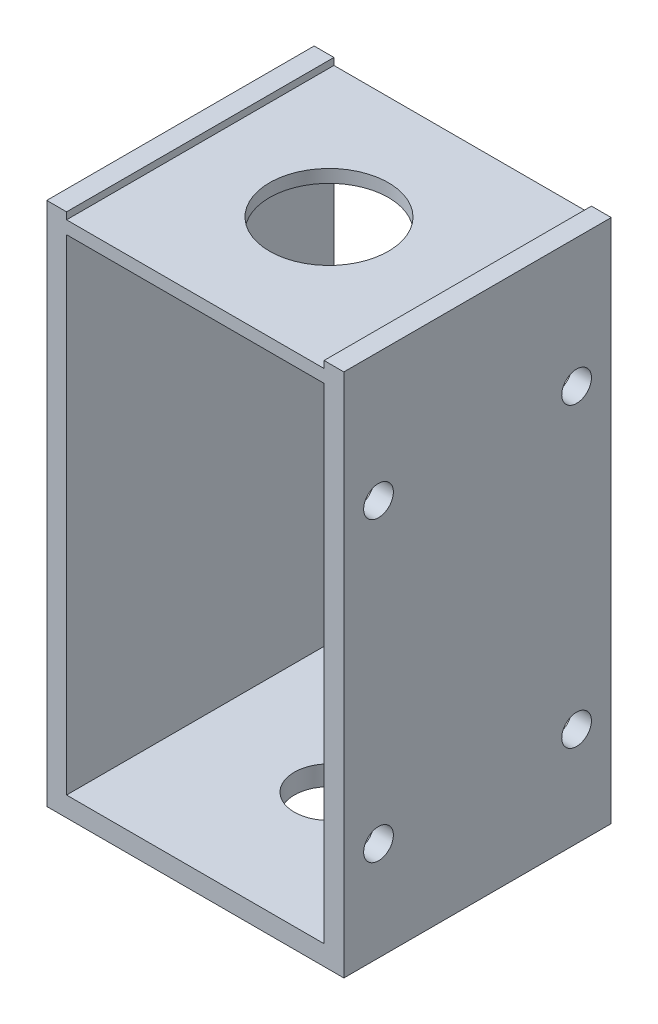
ISO-10303-21;
HEADER;
FILE_DESCRIPTION(('STEP AP214'),'2;1');
FILE_NAME('part.step','',(''),(''),'','','');
FILE_SCHEMA(('AUTOMOTIVE_DESIGN { 1 0 10303 214 1 1 1 1 }'));
ENDSEC;
DATA;
#1=APPLICATION_CONTEXT('core data for automotive mechanical design processes');
#2=APPLICATION_PROTOCOL_DEFINITION('international standard','automotive_design',2000,#1);
#3=PRODUCT_CONTEXT('',#1,'mechanical');
#4=PRODUCT('Part','Part','',(#3));
#5=PRODUCT_RELATED_PRODUCT_CATEGORY('part','',(#4));
#6=PRODUCT_DEFINITION_FORMATION('','',#4);
#7=PRODUCT_DEFINITION_CONTEXT('part definition',#1,'design');
#8=PRODUCT_DEFINITION('design','',#6,#7);
#9=PRODUCT_DEFINITION_SHAPE('','',#8);
#10=(LENGTH_UNIT() NAMED_UNIT(*) SI_UNIT(.MILLI.,.METRE.));
#11=(NAMED_UNIT(*) PLANE_ANGLE_UNIT() SI_UNIT($,.RADIAN.));
#12=(NAMED_UNIT(*) SI_UNIT($,.STERADIAN.) SOLID_ANGLE_UNIT());
#13=UNCERTAINTY_MEASURE_WITH_UNIT(LENGTH_MEASURE(1.E-05),#10,'distance_accuracy_value','');
#14=(GEOMETRIC_REPRESENTATION_CONTEXT(3) GLOBAL_UNCERTAINTY_ASSIGNED_CONTEXT((#13)) GLOBAL_UNIT_ASSIGNED_CONTEXT((#10,
#11,#12)) REPRESENTATION_CONTEXT('',''));
#15=CARTESIAN_POINT('',(0.,0.,0.));
#16=DIRECTION('',(0.,0.,1.));
#17=DIRECTION('',(1.,0.,0.));
#18=AXIS2_PLACEMENT_3D('',#15,#16,#17);
#19=CARTESIAN_POINT('',(-15.,26.5,27.));
#20=DIRECTION('',(0.,-1.,0.));
#21=DIRECTION('',(0.,0.,-1.));
#22=AXIS2_PLACEMENT_3D('',#19,#20,#21);
#23=PLANE('',#22);
#24=DIRECTION('',(-1.,0.,0.));
#25=VECTOR('',#24,1.);
#26=CARTESIAN_POINT('',(-15.,26.5,27.));
#27=LINE('',#26,#25);
#28=CARTESIAN_POINT('',(-13.,26.5,27.));
#29=VERTEX_POINT('',#28);
#30=CARTESIAN_POINT('',(-15.,26.5,27.));
#31=VERTEX_POINT('',#30);
#32=EDGE_CURVE('E222',#29,#31,#27,.T.);
#33=ORIENTED_EDGE('',*,*,#32,.F.);
#34=DIRECTION('',(0.,0.,1.));
#35=VECTOR('',#34,1.);
#36=CARTESIAN_POINT('',(-13.,26.5,0.));
#37=LINE('',#36,#35);
#38=CARTESIAN_POINT('',(-13.,26.5,0.));
#39=VERTEX_POINT('',#38);
#40=EDGE_CURVE('E156',#39,#29,#37,.T.);
#41=ORIENTED_EDGE('',*,*,#40,.F.);
#42=DIRECTION('',(-1.,0.,0.));
#43=VECTOR('',#42,1.);
#44=CARTESIAN_POINT('',(-15.,26.5,0.));
#45=LINE('',#44,#43);
#46=CARTESIAN_POINT('',(-15.,26.5,0.));
#47=VERTEX_POINT('',#46);
#48=EDGE_CURVE('E233',#39,#47,#45,.T.);
#49=ORIENTED_EDGE('',*,*,#48,.T.);
#50=DIRECTION('',(0.,0.,-1.));
#51=VECTOR('',#50,1.);
#52=CARTESIAN_POINT('',(-15.,26.5,27.));
#53=LINE('',#52,#51);
#54=EDGE_CURVE('E69',#31,#47,#53,.T.);
#55=ORIENTED_EDGE('',*,*,#54,.F.);
#56=EDGE_LOOP('',(#33,#41,#49,#55));
#57=FACE_BOUND('',#56,.T.);
#58=ADVANCED_FACE('F60',(#57),#23,.F.);
#59=CARTESIAN_POINT('',(0.,0.,27.));
#60=DIRECTION('',(0.,0.,1.));
#61=DIRECTION('',(1.,0.,0.));
#62=AXIS2_PLACEMENT_3D('',#59,#60,#61);
#63=PLANE('',#62);
#64=DIRECTION('',(0.,1.,0.));
#65=VECTOR('',#64,1.);
#66=CARTESIAN_POINT('',(-13.,25.8,27.));
#67=LINE('',#66,#65);
#68=CARTESIAN_POINT('',(-13.,25.8,27.));
#69=VERTEX_POINT('',#68);
#70=EDGE_CURVE('E150',#69,#29,#67,.T.);
#71=ORIENTED_EDGE('',*,*,#70,.T.);
#72=ORIENTED_EDGE('',*,*,#32,.T.);
#73=DIRECTION('',(0.,-1.,0.));
#74=VECTOR('',#73,1.);
#75=CARTESIAN_POINT('',(-15.,26.5,27.));
#76=LINE('',#75,#74);
#77=CARTESIAN_POINT('',(-15.,-26.5,27.));
#78=VERTEX_POINT('',#77);
#79=EDGE_CURVE('E226',#31,#78,#76,.T.);
#80=ORIENTED_EDGE('',*,*,#79,.T.);
#81=DIRECTION('',(1.,0.,0.));
#82=VECTOR('',#81,1.);
#83=CARTESIAN_POINT('',(-15.,-26.5,27.));
#84=LINE('',#83,#82);
#85=CARTESIAN_POINT('',(15.,-26.5,27.));
#86=VERTEX_POINT('',#85);
#87=EDGE_CURVE('E228',#78,#86,#84,.T.);
#88=ORIENTED_EDGE('',*,*,#87,.T.);
#89=DIRECTION('',(0.,1.,0.));
#90=VECTOR('',#89,1.);
#91=CARTESIAN_POINT('',(15.,26.5,27.));
#92=LINE('',#91,#90);
#93=CARTESIAN_POINT('',(15.,26.5,27.));
#94=VERTEX_POINT('',#93);
#95=EDGE_CURVE('E219',#86,#94,#92,.T.);
#96=ORIENTED_EDGE('',*,*,#95,.T.);
#97=CARTESIAN_POINT('',(13.,26.5,27.));
#98=VERTEX_POINT('',#97);
#99=EDGE_CURVE('E224',#94,#98,#27,.T.);
#100=ORIENTED_EDGE('',*,*,#99,.T.);
#101=DIRECTION('',(0.,1.,0.));
#102=VECTOR('',#101,1.);
#103=CARTESIAN_POINT('',(13.,25.8,27.));
#104=LINE('',#103,#102);
#105=CARTESIAN_POINT('',(13.,25.8,27.));
#106=VERTEX_POINT('',#105);
#107=EDGE_CURVE('E77',#106,#98,#104,.T.);
#108=ORIENTED_EDGE('',*,*,#107,.F.);
#109=DIRECTION('',(1.,0.,0.));
#110=VECTOR('',#109,1.);
#111=CARTESIAN_POINT('',(-13.,25.8,27.));
#112=LINE('',#111,#110);
#113=EDGE_CURVE('E166',#69,#106,#112,.T.);
#114=ORIENTED_EDGE('',*,*,#113,.F.);
#115=EDGE_LOOP('',(#71,#72,#80,#88,#96,#100,#108,#114));
#116=FACE_BOUND('',#115,.T.);
#117=DIRECTION('',(-1.,0.,0.));
#118=VECTOR('',#117,1.);
#119=CARTESIAN_POINT('',(-15.,24.5,27.));
#120=LINE('',#119,#118);
#121=CARTESIAN_POINT('',(13.,24.5,27.));
#122=VERTEX_POINT('',#121);
#123=CARTESIAN_POINT('',(-13.,24.5,27.));
#124=VERTEX_POINT('',#123);
#125=EDGE_CURVE('E192',#122,#124,#120,.T.);
#126=ORIENTED_EDGE('',*,*,#125,.F.);
#127=DIRECTION('',(0.,1.,0.));
#128=VECTOR('',#127,1.);
#129=CARTESIAN_POINT('',(13.,26.5,27.));
#130=LINE('',#129,#128);
#131=CARTESIAN_POINT('',(13.,-24.5,27.));
#132=VERTEX_POINT('',#131);
#133=EDGE_CURVE('E190',#132,#122,#130,.T.);
#134=ORIENTED_EDGE('',*,*,#133,.F.);
#135=DIRECTION('',(1.,0.,0.));
#136=VECTOR('',#135,1.);
#137=CARTESIAN_POINT('',(-15.,-24.5,27.));
#138=LINE('',#137,#136);
#139=CARTESIAN_POINT('',(-13.,-24.5,27.));
#140=VERTEX_POINT('',#139);
#141=EDGE_CURVE('E197',#140,#132,#138,.T.);
#142=ORIENTED_EDGE('',*,*,#141,.F.);
#143=DIRECTION('',(0.,-1.,0.));
#144=VECTOR('',#143,1.);
#145=CARTESIAN_POINT('',(-13.,26.5,27.));
#146=LINE('',#145,#144);
#147=EDGE_CURVE('E195',#124,#140,#146,.T.);
#148=ORIENTED_EDGE('',*,*,#147,.F.);
#149=EDGE_LOOP('',(#126,#134,#142,#148));
#150=FACE_BOUND('',#149,.T.);
#151=ADVANCED_FACE('F171',(#116,#150),#63,.T.);
#152=CARTESIAN_POINT('',(0.,0.,0.));
#153=DIRECTION('',(0.,0.,1.));
#154=DIRECTION('',(1.,0.,0.));
#155=AXIS2_PLACEMENT_3D('',#152,#153,#154);
#156=PLANE('',#155);
#157=ORIENTED_EDGE('',*,*,#48,.F.);
#158=DIRECTION('',(0.,1.,0.));
#159=VECTOR('',#158,1.);
#160=CARTESIAN_POINT('',(-13.,25.8,0.));
#161=LINE('',#160,#159);
#162=CARTESIAN_POINT('',(-13.,25.8,0.));
#163=VERTEX_POINT('',#162);
#164=EDGE_CURVE('E183',#163,#39,#161,.T.);
#165=ORIENTED_EDGE('',*,*,#164,.F.);
#166=DIRECTION('',(-1.,0.,0.));
#167=VECTOR('',#166,1.);
#168=CARTESIAN_POINT('',(-13.,25.8,0.));
#169=LINE('',#168,#167);
#170=CARTESIAN_POINT('',(13.,25.8,0.));
#171=VERTEX_POINT('',#170);
#172=EDGE_CURVE('E160',#171,#163,#169,.T.);
#173=ORIENTED_EDGE('',*,*,#172,.F.);
#174=DIRECTION('',(0.,1.,0.));
#175=VECTOR('',#174,1.);
#176=CARTESIAN_POINT('',(13.,25.8,0.));
#177=LINE('',#176,#175);
#178=CARTESIAN_POINT('',(13.,26.5,0.));
#179=VERTEX_POINT('',#178);
#180=EDGE_CURVE('E186',#171,#179,#177,.T.);
#181=ORIENTED_EDGE('',*,*,#180,.T.);
#182=CARTESIAN_POINT('',(15.,26.5,0.));
#183=VERTEX_POINT('',#182);
#184=EDGE_CURVE('E234',#183,#179,#45,.T.);
#185=ORIENTED_EDGE('',*,*,#184,.F.);
#186=DIRECTION('',(0.,1.,0.));
#187=VECTOR('',#186,1.);
#188=CARTESIAN_POINT('',(15.,26.5,0.));
#189=LINE('',#188,#187);
#190=CARTESIAN_POINT('',(15.,-26.5,0.));
#191=VERTEX_POINT('',#190);
#192=EDGE_CURVE('E218',#191,#183,#189,.T.);
#193=ORIENTED_EDGE('',*,*,#192,.F.);
#194=DIRECTION('',(1.,0.,0.));
#195=VECTOR('',#194,1.);
#196=CARTESIAN_POINT('',(-15.,-26.5,0.));
#197=LINE('',#196,#195);
#198=CARTESIAN_POINT('',(-15.,-26.5,0.));
#199=VERTEX_POINT('',#198);
#200=EDGE_CURVE('E223',#199,#191,#197,.T.);
#201=ORIENTED_EDGE('',*,*,#200,.F.);
#202=DIRECTION('',(0.,-1.,0.));
#203=VECTOR('',#202,1.);
#204=CARTESIAN_POINT('',(-15.,26.5,0.));
#205=LINE('',#204,#203);
#206=EDGE_CURVE('E237',#47,#199,#205,.T.);
#207=ORIENTED_EDGE('',*,*,#206,.F.);
#208=EDGE_LOOP('',(#157,#165,#173,#181,#185,#193,#201,#207));
#209=FACE_BOUND('',#208,.T.);
#210=DIRECTION('',(0.,1.,0.));
#211=VECTOR('',#210,1.);
#212=CARTESIAN_POINT('',(13.,26.5,0.));
#213=LINE('',#212,#211);
#214=CARTESIAN_POINT('',(13.,-24.5,0.));
#215=VERTEX_POINT('',#214);
#216=CARTESIAN_POINT('',(13.,24.5,0.));
#217=VERTEX_POINT('',#216);
#218=EDGE_CURVE('E185',#215,#217,#213,.T.);
#219=ORIENTED_EDGE('',*,*,#218,.T.);
#220=DIRECTION('',(-1.,0.,0.));
#221=VECTOR('',#220,1.);
#222=CARTESIAN_POINT('',(-15.,24.5,0.));
#223=LINE('',#222,#221);
#224=CARTESIAN_POINT('',(-13.,24.5,0.));
#225=VERTEX_POINT('',#224);
#226=EDGE_CURVE('E202',#217,#225,#223,.T.);
#227=ORIENTED_EDGE('',*,*,#226,.T.);
#228=DIRECTION('',(0.,-1.,0.));
#229=VECTOR('',#228,1.);
#230=CARTESIAN_POINT('',(-13.,26.5,0.));
#231=LINE('',#230,#229);
#232=CARTESIAN_POINT('',(-13.,-24.5,0.));
#233=VERTEX_POINT('',#232);
#234=EDGE_CURVE('E205',#225,#233,#231,.T.);
#235=ORIENTED_EDGE('',*,*,#234,.T.);
#236=DIRECTION('',(1.,0.,0.));
#237=VECTOR('',#236,1.);
#238=CARTESIAN_POINT('',(-15.,-24.5,0.));
#239=LINE('',#238,#237);
#240=EDGE_CURVE('E193',#233,#215,#239,.T.);
#241=ORIENTED_EDGE('',*,*,#240,.T.);
#242=EDGE_LOOP('',(#219,#227,#235,#241));
#243=FACE_BOUND('',#242,.T.);
#244=ADVANCED_FACE('F305',(#209,#243),#156,.F.);
#245=CARTESIAN_POINT('',(15.,26.5,27.));
#246=DIRECTION('',(-1.,0.,0.));
#247=DIRECTION('',(0.,-1.,0.));
#248=AXIS2_PLACEMENT_3D('',#245,#246,#247);
#249=PLANE('',#248);
#250=CARTESIAN_POINT('',(15.,13.5,3.5));
#251=DIRECTION('',(1.,0.,0.));
#252=DIRECTION('',(0.,1.,0.));
#253=AXIS2_PLACEMENT_3D('',#250,#251,#252);
#254=CIRCLE('',#253,1.5);
#255=CARTESIAN_POINT('',(15.,15.,3.5));
#256=VERTEX_POINT('',#255);
#257=EDGE_CURVE('E269',#256,#256,#254,.T.);
#258=ORIENTED_EDGE('',*,*,#257,.F.);
#259=EDGE_LOOP('',(#258));
#260=FACE_BOUND('',#259,.T.);
#261=CARTESIAN_POINT('',(15.,-16.5,23.5));
#262=DIRECTION('',(1.,0.,0.));
#263=DIRECTION('',(0.,-1.,0.));
#264=AXIS2_PLACEMENT_3D('',#261,#262,#263);
#265=CIRCLE('',#264,1.5);
#266=CARTESIAN_POINT('',(15.,-18.,23.5));
#267=VERTEX_POINT('',#266);
#268=EDGE_CURVE('E270',#267,#267,#265,.T.);
#269=ORIENTED_EDGE('',*,*,#268,.F.);
#270=EDGE_LOOP('',(#269));
#271=FACE_BOUND('',#270,.T.);
#272=CARTESIAN_POINT('',(15.,13.5,23.5));
#273=DIRECTION('',(1.,0.,0.));
#274=DIRECTION('',(0.,-1.,0.));
#275=AXIS2_PLACEMENT_3D('',#272,#273,#274);
#276=CIRCLE('',#275,1.5);
#277=CARTESIAN_POINT('',(15.,12.,23.5));
#278=VERTEX_POINT('',#277);
#279=EDGE_CURVE('E273',#278,#278,#276,.T.);
#280=ORIENTED_EDGE('',*,*,#279,.F.);
#281=EDGE_LOOP('',(#280));
#282=FACE_BOUND('',#281,.T.);
#283=CARTESIAN_POINT('',(15.,-16.5,3.49999999999999));
#284=DIRECTION('',(1.,0.,0.));
#285=DIRECTION('',(0.,1.,0.));
#286=AXIS2_PLACEMENT_3D('',#283,#284,#285);
#287=CIRCLE('',#286,1.5);
#288=CARTESIAN_POINT('',(15.,-15.,3.49999999999999));
#289=VERTEX_POINT('',#288);
#290=EDGE_CURVE('E254',#289,#289,#287,.T.);
#291=ORIENTED_EDGE('',*,*,#290,.F.);
#292=EDGE_LOOP('',(#291));
#293=FACE_BOUND('',#292,.T.);
#294=ORIENTED_EDGE('',*,*,#192,.T.);
#295=DIRECTION('',(0.,0.,-1.));
#296=VECTOR('',#295,1.);
#297=CARTESIAN_POINT('',(15.,26.5,27.));
#298=LINE('',#297,#296);
#299=EDGE_CURVE('E12',#94,#183,#298,.T.);
#300=ORIENTED_EDGE('',*,*,#299,.F.);
#301=ORIENTED_EDGE('',*,*,#95,.F.);
#302=DIRECTION('',(0.,0.,-1.));
#303=VECTOR('',#302,1.);
#304=CARTESIAN_POINT('',(15.,-26.5,27.));
#305=LINE('',#304,#303);
#306=EDGE_CURVE('E230',#86,#191,#305,.T.);
#307=ORIENTED_EDGE('',*,*,#306,.T.);
#308=EDGE_LOOP('',(#294,#300,#301,#307));
#309=FACE_BOUND('',#308,.T.);
#310=ADVANCED_FACE('F62',(#260,#271,#282,#293,#309),#249,.F.);
#311=ORIENTED_EDGE('',*,*,#184,.T.);
#312=DIRECTION('',(0.,0.,-1.));
#313=VECTOR('',#312,1.);
#314=CARTESIAN_POINT('',(13.,26.5,0.));
#315=LINE('',#314,#313);
#316=EDGE_CURVE('E169',#98,#179,#315,.T.);
#317=ORIENTED_EDGE('',*,*,#316,.F.);
#318=ORIENTED_EDGE('',*,*,#99,.F.);
#319=ORIENTED_EDGE('',*,*,#299,.T.);
#320=EDGE_LOOP('',(#311,#317,#318,#319));
#321=FACE_BOUND('',#320,.T.);
#322=ADVANCED_FACE('F301',(#321),#23,.F.);
#323=CARTESIAN_POINT('',(-15.,26.5,27.));
#324=DIRECTION('',(1.,0.,0.));
#325=DIRECTION('',(0.,1.,0.));
#326=AXIS2_PLACEMENT_3D('',#323,#324,#325);
#327=PLANE('',#326);
#328=ORIENTED_EDGE('',*,*,#206,.T.);
#329=DIRECTION('',(0.,0.,-1.));
#330=VECTOR('',#329,1.);
#331=CARTESIAN_POINT('',(-15.,-26.5,27.));
#332=LINE('',#331,#330);
#333=EDGE_CURVE('E242',#78,#199,#332,.T.);
#334=ORIENTED_EDGE('',*,*,#333,.F.);
#335=ORIENTED_EDGE('',*,*,#79,.F.);
#336=ORIENTED_EDGE('',*,*,#54,.T.);
#337=EDGE_LOOP('',(#328,#334,#335,#336));
#338=FACE_BOUND('',#337,.T.);
#339=ADVANCED_FACE('F309',(#338),#327,.F.);
#340=CARTESIAN_POINT('',(-15.,-26.5,27.));
#341=DIRECTION('',(0.,1.,0.));
#342=DIRECTION('',(0.,0.,1.));
#343=AXIS2_PLACEMENT_3D('',#340,#341,#342);
#344=PLANE('',#343);
#345=CARTESIAN_POINT('',(0.,-26.5,13.5));
#346=DIRECTION('',(0.,-1.,0.));
#347=DIRECTION('',(0.,0.,-1.));
#348=AXIS2_PLACEMENT_3D('',#345,#346,#347);
#349=CIRCLE('',#348,3.5);
#350=CARTESIAN_POINT('',(0.,-26.5,10.));
#351=VERTEX_POINT('',#350);
#352=EDGE_CURVE('E249',#351,#351,#349,.T.);
#353=ORIENTED_EDGE('',*,*,#352,.F.);
#354=EDGE_LOOP('',(#353));
#355=FACE_BOUND('',#354,.T.);
#356=ORIENTED_EDGE('',*,*,#200,.T.);
#357=ORIENTED_EDGE('',*,*,#306,.F.);
#358=ORIENTED_EDGE('',*,*,#87,.F.);
#359=ORIENTED_EDGE('',*,*,#333,.T.);
#360=EDGE_LOOP('',(#356,#357,#358,#359));
#361=FACE_BOUND('',#360,.T.);
#362=ADVANCED_FACE('F315',(#355,#361),#344,.F.);
#363=CARTESIAN_POINT('',(13.,26.5,27.));
#364=DIRECTION('',(-1.,0.,0.));
#365=DIRECTION('',(0.,-1.,0.));
#366=AXIS2_PLACEMENT_3D('',#363,#364,#365);
#367=PLANE('',#366);
#368=CARTESIAN_POINT('',(13.,13.5,3.5));
#369=DIRECTION('',(-1.,0.,0.));
#370=DIRECTION('',(0.,-1.,0.));
#371=AXIS2_PLACEMENT_3D('',#368,#369,#370);
#372=CIRCLE('',#371,1.5);
#373=CARTESIAN_POINT('',(13.,12.,3.5));
#374=VERTEX_POINT('',#373);
#375=EDGE_CURVE('E64',#374,#374,#372,.T.);
#376=ORIENTED_EDGE('',*,*,#375,.F.);
#377=EDGE_LOOP('',(#376));
#378=FACE_BOUND('',#377,.T.);
#379=CARTESIAN_POINT('',(13.,-16.5,23.5));
#380=DIRECTION('',(-1.,0.,0.));
#381=DIRECTION('',(0.,-1.,0.));
#382=AXIS2_PLACEMENT_3D('',#379,#380,#381);
#383=CIRCLE('',#382,1.5);
#384=CARTESIAN_POINT('',(13.,-18.,23.5));
#385=VERTEX_POINT('',#384);
#386=EDGE_CURVE('E256',#385,#385,#383,.T.);
#387=ORIENTED_EDGE('',*,*,#386,.F.);
#388=EDGE_LOOP('',(#387));
#389=FACE_BOUND('',#388,.T.);
#390=CARTESIAN_POINT('',(13.,13.5,23.5));
#391=DIRECTION('',(-1.,0.,0.));
#392=DIRECTION('',(0.,-1.,0.));
#393=AXIS2_PLACEMENT_3D('',#390,#391,#392);
#394=CIRCLE('',#393,1.5);
#395=CARTESIAN_POINT('',(13.,12.,23.5));
#396=VERTEX_POINT('',#395);
#397=EDGE_CURVE('E253',#396,#396,#394,.T.);
#398=ORIENTED_EDGE('',*,*,#397,.F.);
#399=EDGE_LOOP('',(#398));
#400=FACE_BOUND('',#399,.T.);
#401=CARTESIAN_POINT('',(13.,-16.5,3.49999999999999));
#402=DIRECTION('',(-1.,0.,0.));
#403=DIRECTION('',(0.,-1.,0.));
#404=AXIS2_PLACEMENT_3D('',#401,#402,#403);
#405=CIRCLE('',#404,1.5);
#406=CARTESIAN_POINT('',(13.,-18.,3.49999999999999));
#407=VERTEX_POINT('',#406);
#408=EDGE_CURVE('E250',#407,#407,#405,.T.);
#409=ORIENTED_EDGE('',*,*,#408,.F.);
#410=EDGE_LOOP('',(#409));
#411=FACE_BOUND('',#410,.T.);
#412=ORIENTED_EDGE('',*,*,#218,.F.);
#413=DIRECTION('',(0.,0.,-1.));
#414=VECTOR('',#413,1.);
#415=CARTESIAN_POINT('',(13.,-24.5,27.));
#416=LINE('',#415,#414);
#417=EDGE_CURVE('E199',#132,#215,#416,.T.);
#418=ORIENTED_EDGE('',*,*,#417,.F.);
#419=ORIENTED_EDGE('',*,*,#133,.T.);
#420=DIRECTION('',(0.,0.,-1.));
#421=VECTOR('',#420,1.);
#422=CARTESIAN_POINT('',(13.,24.5,27.));
#423=LINE('',#422,#421);
#424=EDGE_CURVE('E215',#122,#217,#423,.T.);
#425=ORIENTED_EDGE('',*,*,#424,.T.);
#426=EDGE_LOOP('',(#412,#418,#419,#425));
#427=FACE_BOUND('',#426,.T.);
#428=ADVANCED_FACE('F334',(#378,#389,#400,#411,#427),#367,.T.);
#429=CARTESIAN_POINT('',(-15.,24.5,27.));
#430=DIRECTION('',(0.,-1.,0.));
#431=DIRECTION('',(0.,0.,-1.));
#432=AXIS2_PLACEMENT_3D('',#429,#430,#431);
#433=PLANE('',#432);
#434=CARTESIAN_POINT('',(0.,24.5,13.5));
#435=DIRECTION('',(0.,-1.,0.));
#436=DIRECTION('',(0.,0.,-1.));
#437=AXIS2_PLACEMENT_3D('',#434,#435,#436);
#438=CIRCLE('',#437,6.);
#439=CARTESIAN_POINT('',(0.,24.5,7.5));
#440=VERTEX_POINT('',#439);
#441=EDGE_CURVE('E278',#440,#440,#438,.T.);
#442=ORIENTED_EDGE('',*,*,#441,.F.);
#443=EDGE_LOOP('',(#442));
#444=FACE_BOUND('',#443,.T.);
#445=ORIENTED_EDGE('',*,*,#226,.F.);
#446=ORIENTED_EDGE('',*,*,#424,.F.);
#447=ORIENTED_EDGE('',*,*,#125,.T.);
#448=DIRECTION('',(0.,0.,-1.));
#449=VECTOR('',#448,1.);
#450=CARTESIAN_POINT('',(-13.,24.5,27.));
#451=LINE('',#450,#449);
#452=EDGE_CURVE('E213',#124,#225,#451,.T.);
#453=ORIENTED_EDGE('',*,*,#452,.T.);
#454=EDGE_LOOP('',(#445,#446,#447,#453));
#455=FACE_BOUND('',#454,.T.);
#456=ADVANCED_FACE('F340',(#444,#455),#433,.T.);
#457=CARTESIAN_POINT('',(-13.,26.5,27.));
#458=DIRECTION('',(1.,0.,0.));
#459=DIRECTION('',(0.,1.,0.));
#460=AXIS2_PLACEMENT_3D('',#457,#458,#459);
#461=PLANE('',#460);
#462=ORIENTED_EDGE('',*,*,#234,.F.);
#463=ORIENTED_EDGE('',*,*,#452,.F.);
#464=ORIENTED_EDGE('',*,*,#147,.T.);
#465=DIRECTION('',(0.,0.,-1.));
#466=VECTOR('',#465,1.);
#467=CARTESIAN_POINT('',(-13.,-24.5,27.));
#468=LINE('',#467,#466);
#469=EDGE_CURVE('E85',#140,#233,#468,.T.);
#470=ORIENTED_EDGE('',*,*,#469,.T.);
#471=EDGE_LOOP('',(#462,#463,#464,#470));
#472=FACE_BOUND('',#471,.T.);
#473=ADVANCED_FACE('F348',(#472),#461,.T.);
#474=CARTESIAN_POINT('',(-15.,-24.5,27.));
#475=DIRECTION('',(0.,1.,0.));
#476=DIRECTION('',(0.,0.,1.));
#477=AXIS2_PLACEMENT_3D('',#474,#475,#476);
#478=PLANE('',#477);
#479=CARTESIAN_POINT('',(0.,-24.5,13.5));
#480=DIRECTION('',(0.,1.,0.));
#481=DIRECTION('',(0.,0.,1.));
#482=AXIS2_PLACEMENT_3D('',#479,#480,#481);
#483=CIRCLE('',#482,3.5);
#484=CARTESIAN_POINT('',(0.,-24.5,17.));
#485=VERTEX_POINT('',#484);
#486=EDGE_CURVE('E181',#485,#485,#483,.T.);
#487=ORIENTED_EDGE('',*,*,#486,.F.);
#488=EDGE_LOOP('',(#487));
#489=FACE_BOUND('',#488,.T.);
#490=ORIENTED_EDGE('',*,*,#240,.F.);
#491=ORIENTED_EDGE('',*,*,#469,.F.);
#492=ORIENTED_EDGE('',*,*,#141,.T.);
#493=ORIENTED_EDGE('',*,*,#417,.T.);
#494=EDGE_LOOP('',(#490,#491,#492,#493));
#495=FACE_BOUND('',#494,.T.);
#496=ADVANCED_FACE('F352',(#489,#495),#478,.T.);
#497=CARTESIAN_POINT('',(-13.,25.8,0.));
#498=DIRECTION('',(-1.,0.,0.));
#499=DIRECTION('',(0.,0.,1.));
#500=AXIS2_PLACEMENT_3D('',#497,#498,#499);
#501=PLANE('',#500);
#502=ORIENTED_EDGE('',*,*,#40,.T.);
#503=ORIENTED_EDGE('',*,*,#70,.F.);
#504=DIRECTION('',(0.,0.,1.));
#505=VECTOR('',#504,1.);
#506=CARTESIAN_POINT('',(-13.,25.8,0.));
#507=LINE('',#506,#505);
#508=EDGE_CURVE('E153',#163,#69,#507,.T.);
#509=ORIENTED_EDGE('',*,*,#508,.F.);
#510=ORIENTED_EDGE('',*,*,#164,.T.);
#511=EDGE_LOOP('',(#502,#503,#509,#510));
#512=FACE_BOUND('',#511,.T.);
#513=ADVANCED_FACE('F152',(#512),#501,.F.);
#514=CARTESIAN_POINT('',(13.,25.8,0.));
#515=DIRECTION('',(1.,0.,0.));
#516=DIRECTION('',(0.,0.,-1.));
#517=AXIS2_PLACEMENT_3D('',#514,#515,#516);
#518=PLANE('',#517);
#519=ORIENTED_EDGE('',*,*,#316,.T.);
#520=ORIENTED_EDGE('',*,*,#180,.F.);
#521=DIRECTION('',(0.,0.,-1.));
#522=VECTOR('',#521,1.);
#523=CARTESIAN_POINT('',(13.,25.8,0.));
#524=LINE('',#523,#522);
#525=EDGE_CURVE('E174',#106,#171,#524,.T.);
#526=ORIENTED_EDGE('',*,*,#525,.F.);
#527=ORIENTED_EDGE('',*,*,#107,.T.);
#528=EDGE_LOOP('',(#519,#520,#526,#527));
#529=FACE_BOUND('',#528,.T.);
#530=ADVANCED_FACE('F289',(#529),#518,.F.);
#531=CARTESIAN_POINT('',(0.,25.8,0.));
#532=DIRECTION('',(0.,1.,0.));
#533=DIRECTION('',(0.,0.,1.));
#534=AXIS2_PLACEMENT_3D('',#531,#532,#533);
#535=PLANE('',#534);
#536=CARTESIAN_POINT('',(0.,25.8,13.5));
#537=DIRECTION('',(0.,1.,0.));
#538=DIRECTION('',(0.,0.,1.));
#539=AXIS2_PLACEMENT_3D('',#536,#537,#538);
#540=CIRCLE('',#539,6.);
#541=CARTESIAN_POINT('',(0.,25.8,19.5));
#542=VERTEX_POINT('',#541);
#543=EDGE_CURVE('E281',#542,#542,#540,.T.);
#544=ORIENTED_EDGE('',*,*,#543,.F.);
#545=EDGE_LOOP('',(#544));
#546=FACE_BOUND('',#545,.T.);
#547=ORIENTED_EDGE('',*,*,#508,.T.);
#548=ORIENTED_EDGE('',*,*,#113,.T.);
#549=ORIENTED_EDGE('',*,*,#525,.T.);
#550=ORIENTED_EDGE('',*,*,#172,.T.);
#551=EDGE_LOOP('',(#547,#548,#549,#550));
#552=FACE_BOUND('',#551,.T.);
#553=ADVANCED_FACE('F164',(#546,#552),#535,.T.);
#554=CARTESIAN_POINT('',(0.,11.5,13.5));
#555=DIRECTION('',(0.,-1.,0.));
#556=DIRECTION('',(0.,0.,-1.));
#557=AXIS2_PLACEMENT_3D('',#554,#555,#556);
#558=CYLINDRICAL_SURFACE('',#557,3.5);
#559=ORIENTED_EDGE('',*,*,#486,.T.);
#560=EDGE_LOOP('',(#559));
#561=FACE_BOUND('',#560,.T.);
#562=ORIENTED_EDGE('',*,*,#352,.T.);
#563=EDGE_LOOP('',(#562));
#564=FACE_BOUND('',#563,.T.);
#565=ADVANCED_FACE('F288',(#561,#564),#558,.F.);
#566=CARTESIAN_POINT('',(12.,-16.5,3.49999999999999));
#567=DIRECTION('',(1.,0.,0.));
#568=DIRECTION('',(0.,1.,0.));
#569=AXIS2_PLACEMENT_3D('',#566,#567,#568);
#570=CYLINDRICAL_SURFACE('',#569,1.5);
#571=ORIENTED_EDGE('',*,*,#408,.T.);
#572=EDGE_LOOP('',(#571));
#573=FACE_BOUND('',#572,.T.);
#574=ORIENTED_EDGE('',*,*,#290,.T.);
#575=EDGE_LOOP('',(#574));
#576=FACE_BOUND('',#575,.T.);
#577=ADVANCED_FACE('F295',(#573,#576),#570,.F.);
#578=CARTESIAN_POINT('',(12.,13.5,23.5));
#579=DIRECTION('',(1.,0.,0.));
#580=DIRECTION('',(0.,1.,0.));
#581=AXIS2_PLACEMENT_3D('',#578,#579,#580);
#582=CYLINDRICAL_SURFACE('',#581,1.5);
#583=ORIENTED_EDGE('',*,*,#397,.T.);
#584=EDGE_LOOP('',(#583));
#585=FACE_BOUND('',#584,.T.);
#586=ORIENTED_EDGE('',*,*,#279,.T.);
#587=EDGE_LOOP('',(#586));
#588=FACE_BOUND('',#587,.T.);
#589=ADVANCED_FACE('F408',(#585,#588),#582,.F.);
#590=CARTESIAN_POINT('',(12.,-16.5,23.5));
#591=DIRECTION('',(1.,0.,0.));
#592=DIRECTION('',(0.,1.,0.));
#593=AXIS2_PLACEMENT_3D('',#590,#591,#592);
#594=CYLINDRICAL_SURFACE('',#593,1.5);
#595=ORIENTED_EDGE('',*,*,#386,.T.);
#596=EDGE_LOOP('',(#595));
#597=FACE_BOUND('',#596,.T.);
#598=ORIENTED_EDGE('',*,*,#268,.T.);
#599=EDGE_LOOP('',(#598));
#600=FACE_BOUND('',#599,.T.);
#601=ADVANCED_FACE('F418',(#597,#600),#594,.F.);
#602=CARTESIAN_POINT('',(12.,13.5,3.5));
#603=DIRECTION('',(1.,0.,0.));
#604=DIRECTION('',(0.,1.,0.));
#605=AXIS2_PLACEMENT_3D('',#602,#603,#604);
#606=CYLINDRICAL_SURFACE('',#605,1.5);
#607=ORIENTED_EDGE('',*,*,#375,.T.);
#608=EDGE_LOOP('',(#607));
#609=FACE_BOUND('',#608,.T.);
#610=ORIENTED_EDGE('',*,*,#257,.T.);
#611=EDGE_LOOP('',(#610));
#612=FACE_BOUND('',#611,.T.);
#613=ADVANCED_FACE('F428',(#609,#612),#606,.F.);
#614=CARTESIAN_POINT('',(0.,22.8,13.5));
#615=DIRECTION('',(0.,1.,0.));
#616=DIRECTION('',(0.,0.,1.));
#617=AXIS2_PLACEMENT_3D('',#614,#615,#616);
#618=CYLINDRICAL_SURFACE('',#617,6.);
#619=ORIENTED_EDGE('',*,*,#441,.T.);
#620=EDGE_LOOP('',(#619));
#621=FACE_BOUND('',#620,.T.);
#622=ORIENTED_EDGE('',*,*,#543,.T.);
#623=EDGE_LOOP('',(#622));
#624=FACE_BOUND('',#623,.T.);
#625=ADVANCED_FACE('F285',(#621,#624),#618,.F.);
#626=CLOSED_SHELL('',(#58,#151,#244,#310,#322,#339,#362,#428,#456,#473,#496,#513,#530,#553,#565,
#577,#589,#601,#613,#625));
#627=MANIFOLD_SOLID_BREP('B2',#626);
#628=ADVANCED_BREP_SHAPE_REPRESENTATION('',(#18,#627),#14);
#629=SHAPE_DEFINITION_REPRESENTATION(#9,#628);
ENDSEC;
END-ISO-10303-21;
